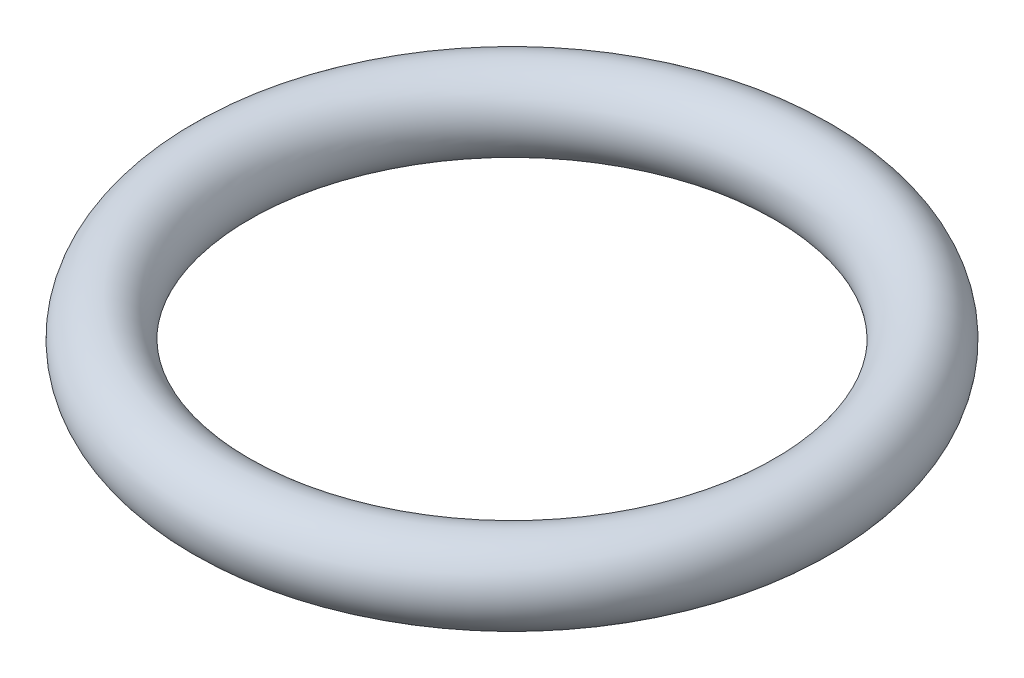
ISO-10303-21;
HEADER;
FILE_DESCRIPTION(('STEP AP214'),'2;1');
FILE_NAME('part.step','',(''),(''),'','','');
FILE_SCHEMA(('AUTOMOTIVE_DESIGN { 1 0 10303 214 1 1 1 1 }'));
ENDSEC;
DATA;
#1=APPLICATION_CONTEXT('core data for automotive mechanical design processes');
#2=APPLICATION_PROTOCOL_DEFINITION('international standard','automotive_design',2000,#1);
#3=PRODUCT_CONTEXT('',#1,'mechanical');
#4=PRODUCT('Part','Part','',(#3));
#5=PRODUCT_RELATED_PRODUCT_CATEGORY('part','',(#4));
#6=PRODUCT_DEFINITION_FORMATION('','',#4);
#7=PRODUCT_DEFINITION_CONTEXT('part definition',#1,'design');
#8=PRODUCT_DEFINITION('design','',#6,#7);
#9=PRODUCT_DEFINITION_SHAPE('','',#8);
#10=(LENGTH_UNIT() NAMED_UNIT(*) SI_UNIT(.MILLI.,.METRE.));
#11=(NAMED_UNIT(*) PLANE_ANGLE_UNIT() SI_UNIT($,.RADIAN.));
#12=(NAMED_UNIT(*) SI_UNIT($,.STERADIAN.) SOLID_ANGLE_UNIT());
#13=UNCERTAINTY_MEASURE_WITH_UNIT(LENGTH_MEASURE(1.E-05),#10,'distance_accuracy_value','');
#14=(GEOMETRIC_REPRESENTATION_CONTEXT(3) GLOBAL_UNCERTAINTY_ASSIGNED_CONTEXT((#13)) GLOBAL_UNIT_ASSIGNED_CONTEXT((#10,
#11,#12)) REPRESENTATION_CONTEXT('',''));
#15=CARTESIAN_POINT('',(0.,0.,0.));
#16=DIRECTION('',(0.,0.,1.));
#17=DIRECTION('',(1.,0.,0.));
#18=AXIS2_PLACEMENT_3D('',#15,#16,#17);
#19=CARTESIAN_POINT('',(0.,0.,0.));
#20=DIRECTION('',(0.,-1.,0.));
#21=DIRECTION('',(0.,0.,-1.));
#22=AXIS2_PLACEMENT_3D('',#19,#20,#21);
#23=TOROIDAL_SURFACE('',#22,4.625,0.625);
#24=CARTESIAN_POINT('',(0.,0.,-5.25));
#25=VERTEX_POINT('',#24);
#26=VERTEX_LOOP('',#25);
#27=FACE_BOUND('',#26,.T.);
#28=ADVANCED_FACE('F12',(#27),#23,.T.);
#29=CLOSED_SHELL('',(#28));
#30=MANIFOLD_SOLID_BREP('B1',#29);
#31=ADVANCED_BREP_SHAPE_REPRESENTATION('',(#18,#30),#14);
#32=SHAPE_DEFINITION_REPRESENTATION(#9,#31);
ENDSEC;
END-ISO-10303-21;
